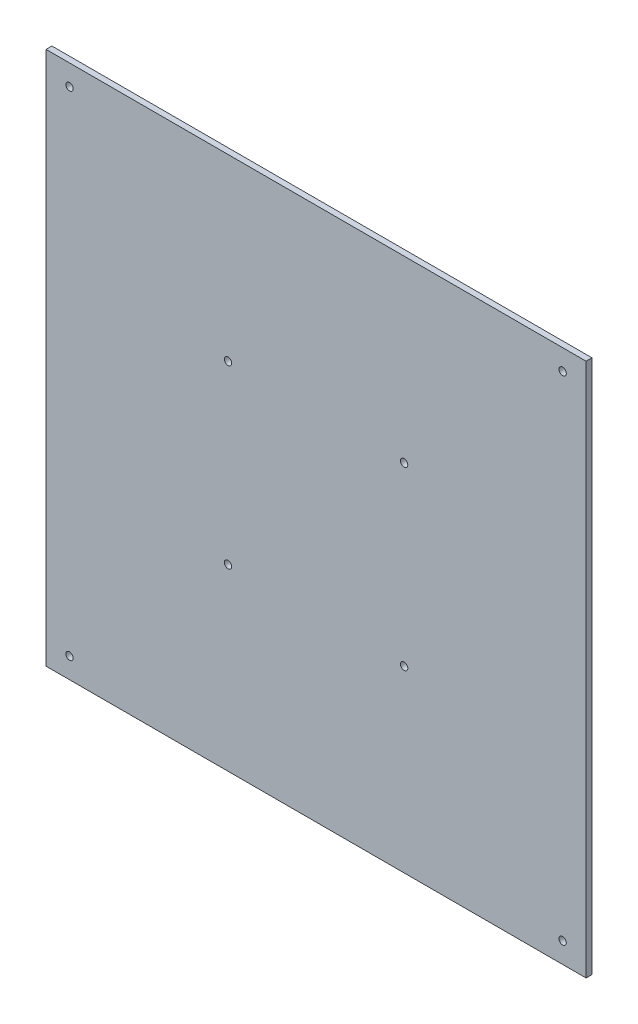
ISO-10303-21;
HEADER;
FILE_DESCRIPTION(('STEP AP214'),'2;1');
FILE_NAME('part.step','',(''),(''),'','','');
FILE_SCHEMA(('AUTOMOTIVE_DESIGN { 1 0 10303 214 1 1 1 1 }'));
ENDSEC;
DATA;
#1=APPLICATION_CONTEXT('core data for automotive mechanical design processes');
#2=APPLICATION_PROTOCOL_DEFINITION('international standard','automotive_design',2000,#1);
#3=PRODUCT_CONTEXT('',#1,'mechanical');
#4=PRODUCT('Part','Part','',(#3));
#5=PRODUCT_RELATED_PRODUCT_CATEGORY('part','',(#4));
#6=PRODUCT_DEFINITION_FORMATION('','',#4);
#7=PRODUCT_DEFINITION_CONTEXT('part definition',#1,'design');
#8=PRODUCT_DEFINITION('design','',#6,#7);
#9=PRODUCT_DEFINITION_SHAPE('','',#8);
#10=(LENGTH_UNIT() NAMED_UNIT(*) SI_UNIT(.MILLI.,.METRE.));
#11=(NAMED_UNIT(*) PLANE_ANGLE_UNIT() SI_UNIT($,.RADIAN.));
#12=(NAMED_UNIT(*) SI_UNIT($,.STERADIAN.) SOLID_ANGLE_UNIT());
#13=UNCERTAINTY_MEASURE_WITH_UNIT(LENGTH_MEASURE(1.E-05),#10,'distance_accuracy_value','');
#14=(GEOMETRIC_REPRESENTATION_CONTEXT(3) GLOBAL_UNCERTAINTY_ASSIGNED_CONTEXT((#13)) GLOBAL_UNIT_ASSIGNED_CONTEXT((#10,
#11,#12)) REPRESENTATION_CONTEXT('',''));
#15=CARTESIAN_POINT('',(0.,0.,0.));
#16=DIRECTION('',(0.,0.,1.));
#17=DIRECTION('',(1.,0.,0.));
#18=AXIS2_PLACEMENT_3D('',#15,#16,#17);
#19=CARTESIAN_POINT('',(0.,0.,2.));
#20=DIRECTION('',(0.,0.,-1.));
#21=DIRECTION('',(-1.,0.,0.));
#22=AXIS2_PLACEMENT_3D('',#19,#20,#21);
#23=PLANE('',#22);
#24=CARTESIAN_POINT('',(122.,121.,2.));
#25=DIRECTION('',(0.,0.,1.));
#26=DIRECTION('',(1.,0.,0.));
#27=AXIS2_PLACEMENT_3D('',#24,#25,#26);
#28=CIRCLE('',#27,1.24999999999999);
#29=CARTESIAN_POINT('',(123.25,121.,2.));
#30=VERTEX_POINT('',#29);
#31=EDGE_CURVE('E151',#30,#30,#28,.T.);
#32=ORIENTED_EDGE('',*,*,#31,.F.);
#33=EDGE_LOOP('',(#32));
#34=FACE_BOUND('',#33,.T.);
#35=CARTESIAN_POINT('',(62.,61.,2.));
#36=DIRECTION('',(0.,0.,1.));
#37=DIRECTION('',(1.,0.,0.));
#38=AXIS2_PLACEMENT_3D('',#35,#36,#37);
#39=CIRCLE('',#38,1.24999999999999);
#40=CARTESIAN_POINT('',(63.25,61.,2.));
#41=VERTEX_POINT('',#40);
#42=EDGE_CURVE('E145',#41,#41,#39,.T.);
#43=ORIENTED_EDGE('',*,*,#42,.F.);
#44=EDGE_LOOP('',(#43));
#45=FACE_BOUND('',#44,.T.);
#46=CARTESIAN_POINT('',(61.9999999999999,121.,2.));
#47=DIRECTION('',(0.,0.,1.));
#48=DIRECTION('',(1.,0.,0.));
#49=AXIS2_PLACEMENT_3D('',#46,#47,#48);
#50=CIRCLE('',#49,1.24999999999999);
#51=CARTESIAN_POINT('',(63.2499999999999,121.,2.));
#52=VERTEX_POINT('',#51);
#53=EDGE_CURVE('E139',#52,#52,#50,.T.);
#54=ORIENTED_EDGE('',*,*,#53,.F.);
#55=EDGE_LOOP('',(#54));
#56=FACE_BOUND('',#55,.T.);
#57=CARTESIAN_POINT('',(8.00000000000001,175.,2.));
#58=DIRECTION('',(0.,0.,1.));
#59=DIRECTION('',(1.,0.,0.));
#60=AXIS2_PLACEMENT_3D('',#57,#58,#59);
#61=CIRCLE('',#60,1.24999999999999);
#62=CARTESIAN_POINT('',(9.24999999999999,175.,2.));
#63=VERTEX_POINT('',#62);
#64=EDGE_CURVE('E133',#63,#63,#61,.T.);
#65=ORIENTED_EDGE('',*,*,#64,.F.);
#66=EDGE_LOOP('',(#65));
#67=FACE_BOUND('',#66,.T.);
#68=CARTESIAN_POINT('',(8.,7.,2.));
#69=DIRECTION('',(0.,0.,1.));
#70=DIRECTION('',(1.,0.,0.));
#71=AXIS2_PLACEMENT_3D('',#68,#69,#70);
#72=CIRCLE('',#71,1.24999999999999);
#73=CARTESIAN_POINT('',(9.24999999999999,7.,2.));
#74=VERTEX_POINT('',#73);
#75=EDGE_CURVE('E127',#74,#74,#72,.T.);
#76=ORIENTED_EDGE('',*,*,#75,.F.);
#77=EDGE_LOOP('',(#76));
#78=FACE_BOUND('',#77,.T.);
#79=CARTESIAN_POINT('',(176.,7.,2.));
#80=DIRECTION('',(0.,0.,1.));
#81=DIRECTION('',(1.,0.,0.));
#82=AXIS2_PLACEMENT_3D('',#79,#80,#81);
#83=CIRCLE('',#82,1.24999999999997);
#84=CARTESIAN_POINT('',(177.25,7.,2.));
#85=VERTEX_POINT('',#84);
#86=EDGE_CURVE('E121',#85,#85,#83,.T.);
#87=ORIENTED_EDGE('',*,*,#86,.F.);
#88=EDGE_LOOP('',(#87));
#89=FACE_BOUND('',#88,.T.);
#90=CARTESIAN_POINT('',(176.,175.,2.));
#91=DIRECTION('',(0.,0.,1.));
#92=DIRECTION('',(1.,0.,0.));
#93=AXIS2_PLACEMENT_3D('',#90,#91,#92);
#94=CIRCLE('',#93,1.24999999999997);
#95=CARTESIAN_POINT('',(177.25,175.,2.));
#96=VERTEX_POINT('',#95);
#97=EDGE_CURVE('E115',#96,#96,#94,.T.);
#98=ORIENTED_EDGE('',*,*,#97,.F.);
#99=EDGE_LOOP('',(#98));
#100=FACE_BOUND('',#99,.T.);
#101=DIRECTION('',(0.,-1.,0.));
#102=VECTOR('',#101,1.);
#103=CARTESIAN_POINT('',(0.,0.,2.));
#104=LINE('',#103,#102);
#105=CARTESIAN_POINT('',(0.,182.,2.));
#106=VERTEX_POINT('',#105);
#107=CARTESIAN_POINT('',(0.,0.,2.));
#108=VERTEX_POINT('',#107);
#109=EDGE_CURVE('E86',#106,#108,#104,.T.);
#110=ORIENTED_EDGE('',*,*,#109,.T.);
#111=DIRECTION('',(1.,0.,0.));
#112=VECTOR('',#111,1.);
#113=CARTESIAN_POINT('',(0.,0.,2.));
#114=LINE('',#113,#112);
#115=CARTESIAN_POINT('',(184.,0.,2.));
#116=VERTEX_POINT('',#115);
#117=EDGE_CURVE('E81',#108,#116,#114,.T.);
#118=ORIENTED_EDGE('',*,*,#117,.T.);
#119=DIRECTION('',(0.,1.,0.));
#120=VECTOR('',#119,1.);
#121=CARTESIAN_POINT('',(184.,0.,2.));
#122=LINE('',#121,#120);
#123=CARTESIAN_POINT('',(184.,182.,2.));
#124=VERTEX_POINT('',#123);
#125=EDGE_CURVE('E84',#116,#124,#122,.T.);
#126=ORIENTED_EDGE('',*,*,#125,.T.);
#127=DIRECTION('',(-1.,0.,0.));
#128=VECTOR('',#127,1.);
#129=CARTESIAN_POINT('',(0.,182.,2.));
#130=LINE('',#129,#128);
#131=EDGE_CURVE('E51',#124,#106,#130,.T.);
#132=ORIENTED_EDGE('',*,*,#131,.T.);
#133=EDGE_LOOP('',(#110,#118,#126,#132));
#134=FACE_BOUND('',#133,.T.);
#135=CARTESIAN_POINT('',(122.,61.,2.));
#136=DIRECTION('',(0.,0.,1.));
#137=DIRECTION('',(1.,0.,0.));
#138=AXIS2_PLACEMENT_3D('',#135,#136,#137);
#139=CIRCLE('',#138,1.24999999999999);
#140=CARTESIAN_POINT('',(123.25,61.,2.));
#141=VERTEX_POINT('',#140);
#142=EDGE_CURVE('E157',#141,#141,#139,.T.);
#143=ORIENTED_EDGE('',*,*,#142,.F.);
#144=EDGE_LOOP('',(#143));
#145=FACE_BOUND('',#144,.T.);
#146=ADVANCED_FACE('F34',(#34,#45,#56,#67,#78,#89,#100,#134,#145),#23,.F.);
#147=CARTESIAN_POINT('',(0.,0.,0.));
#148=DIRECTION('',(0.,0.,-1.));
#149=DIRECTION('',(-1.,0.,0.));
#150=AXIS2_PLACEMENT_3D('',#147,#148,#149);
#151=PLANE('',#150);
#152=CARTESIAN_POINT('',(122.,61.,0.));
#153=DIRECTION('',(0.,0.,1.));
#154=DIRECTION('',(1.,0.,0.));
#155=AXIS2_PLACEMENT_3D('',#152,#153,#154);
#156=CIRCLE('',#155,1.25);
#157=CARTESIAN_POINT('',(123.25,61.,0.));
#158=VERTEX_POINT('',#157);
#159=EDGE_CURVE('E154',#158,#158,#156,.T.);
#160=ORIENTED_EDGE('',*,*,#159,.T.);
#161=EDGE_LOOP('',(#160));
#162=FACE_BOUND('',#161,.T.);
#163=DIRECTION('',(0.,-1.,0.));
#164=VECTOR('',#163,1.);
#165=CARTESIAN_POINT('',(0.,0.,0.));
#166=LINE('',#165,#164);
#167=CARTESIAN_POINT('',(0.,182.,0.));
#168=VERTEX_POINT('',#167);
#169=CARTESIAN_POINT('',(0.,0.,0.));
#170=VERTEX_POINT('',#169);
#171=EDGE_CURVE('E98',#168,#170,#166,.T.);
#172=ORIENTED_EDGE('',*,*,#171,.F.);
#173=DIRECTION('',(-1.,0.,0.));
#174=VECTOR('',#173,1.);
#175=CARTESIAN_POINT('',(0.,182.,0.));
#176=LINE('',#175,#174);
#177=CARTESIAN_POINT('',(184.,182.,0.));
#178=VERTEX_POINT('',#177);
#179=EDGE_CURVE('E74',#178,#168,#176,.T.);
#180=ORIENTED_EDGE('',*,*,#179,.F.);
#181=DIRECTION('',(0.,1.,0.));
#182=VECTOR('',#181,1.);
#183=CARTESIAN_POINT('',(184.,0.,0.));
#184=LINE('',#183,#182);
#185=CARTESIAN_POINT('',(184.,0.,0.));
#186=VERTEX_POINT('',#185);
#187=EDGE_CURVE('E68',#186,#178,#184,.T.);
#188=ORIENTED_EDGE('',*,*,#187,.F.);
#189=DIRECTION('',(1.,0.,0.));
#190=VECTOR('',#189,1.);
#191=CARTESIAN_POINT('',(0.,0.,0.));
#192=LINE('',#191,#190);
#193=EDGE_CURVE('E90',#170,#186,#192,.T.);
#194=ORIENTED_EDGE('',*,*,#193,.F.);
#195=EDGE_LOOP('',(#172,#180,#188,#194));
#196=FACE_BOUND('',#195,.T.);
#197=CARTESIAN_POINT('',(176.,175.,0.));
#198=DIRECTION('',(0.,0.,1.));
#199=DIRECTION('',(1.,0.,0.));
#200=AXIS2_PLACEMENT_3D('',#197,#198,#199);
#201=CIRCLE('',#200,1.24999999999997);
#202=CARTESIAN_POINT('',(177.25,175.,0.));
#203=VERTEX_POINT('',#202);
#204=EDGE_CURVE('E101',#203,#203,#201,.T.);
#205=ORIENTED_EDGE('',*,*,#204,.T.);
#206=EDGE_LOOP('',(#205));
#207=FACE_BOUND('',#206,.T.);
#208=CARTESIAN_POINT('',(176.,7.,0.));
#209=DIRECTION('',(0.,0.,1.));
#210=DIRECTION('',(1.,0.,0.));
#211=AXIS2_PLACEMENT_3D('',#208,#209,#210);
#212=CIRCLE('',#211,1.24999999999997);
#213=CARTESIAN_POINT('',(177.25,7.,0.));
#214=VERTEX_POINT('',#213);
#215=EDGE_CURVE('E118',#214,#214,#212,.T.);
#216=ORIENTED_EDGE('',*,*,#215,.T.);
#217=EDGE_LOOP('',(#216));
#218=FACE_BOUND('',#217,.T.);
#219=CARTESIAN_POINT('',(8.,7.,0.));
#220=DIRECTION('',(0.,0.,1.));
#221=DIRECTION('',(1.,0.,0.));
#222=AXIS2_PLACEMENT_3D('',#219,#220,#221);
#223=CIRCLE('',#222,1.24999999999998);
#224=CARTESIAN_POINT('',(9.24999999999998,7.,0.));
#225=VERTEX_POINT('',#224);
#226=EDGE_CURVE('E124',#225,#225,#223,.T.);
#227=ORIENTED_EDGE('',*,*,#226,.T.);
#228=EDGE_LOOP('',(#227));
#229=FACE_BOUND('',#228,.T.);
#230=CARTESIAN_POINT('',(8.00000000000001,175.,0.));
#231=DIRECTION('',(0.,0.,1.));
#232=DIRECTION('',(1.,0.,0.));
#233=AXIS2_PLACEMENT_3D('',#230,#231,#232);
#234=CIRCLE('',#233,1.24999999999998);
#235=CARTESIAN_POINT('',(9.24999999999998,175.,0.));
#236=VERTEX_POINT('',#235);
#237=EDGE_CURVE('E130',#236,#236,#234,.T.);
#238=ORIENTED_EDGE('',*,*,#237,.T.);
#239=EDGE_LOOP('',(#238));
#240=FACE_BOUND('',#239,.T.);
#241=CARTESIAN_POINT('',(61.9999999999999,121.,0.));
#242=DIRECTION('',(0.,0.,1.));
#243=DIRECTION('',(1.,0.,0.));
#244=AXIS2_PLACEMENT_3D('',#241,#242,#243);
#245=CIRCLE('',#244,1.25);
#246=CARTESIAN_POINT('',(63.2499999999999,121.,0.));
#247=VERTEX_POINT('',#246);
#248=EDGE_CURVE('E136',#247,#247,#245,.T.);
#249=ORIENTED_EDGE('',*,*,#248,.T.);
#250=EDGE_LOOP('',(#249));
#251=FACE_BOUND('',#250,.T.);
#252=CARTESIAN_POINT('',(62.,61.,0.));
#253=DIRECTION('',(0.,0.,1.));
#254=DIRECTION('',(1.,0.,0.));
#255=AXIS2_PLACEMENT_3D('',#252,#253,#254);
#256=CIRCLE('',#255,1.25);
#257=CARTESIAN_POINT('',(63.25,61.,0.));
#258=VERTEX_POINT('',#257);
#259=EDGE_CURVE('E142',#258,#258,#256,.T.);
#260=ORIENTED_EDGE('',*,*,#259,.T.);
#261=EDGE_LOOP('',(#260));
#262=FACE_BOUND('',#261,.T.);
#263=CARTESIAN_POINT('',(122.,121.,0.));
#264=DIRECTION('',(0.,0.,1.));
#265=DIRECTION('',(1.,0.,0.));
#266=AXIS2_PLACEMENT_3D('',#263,#264,#265);
#267=CIRCLE('',#266,1.25);
#268=CARTESIAN_POINT('',(123.25,121.,0.));
#269=VERTEX_POINT('',#268);
#270=EDGE_CURVE('E148',#269,#269,#267,.T.);
#271=ORIENTED_EDGE('',*,*,#270,.T.);
#272=EDGE_LOOP('',(#271));
#273=FACE_BOUND('',#272,.T.);
#274=ADVANCED_FACE('F109',(#162,#196,#207,#218,#229,#240,#251,#262,#273),#151,.T.);
#275=CARTESIAN_POINT('',(0.,0.,2.));
#276=DIRECTION('',(1.,0.,0.));
#277=DIRECTION('',(0.,0.,-1.));
#278=AXIS2_PLACEMENT_3D('',#275,#276,#277);
#279=PLANE('',#278);
#280=ORIENTED_EDGE('',*,*,#171,.T.);
#281=DIRECTION('',(0.,0.,-1.));
#282=VECTOR('',#281,1.);
#283=CARTESIAN_POINT('',(0.,0.,2.));
#284=LINE('',#283,#282);
#285=EDGE_CURVE('E11',#108,#170,#284,.T.);
#286=ORIENTED_EDGE('',*,*,#285,.F.);
#287=ORIENTED_EDGE('',*,*,#109,.F.);
#288=DIRECTION('',(0.,0.,-1.));
#289=VECTOR('',#288,1.);
#290=CARTESIAN_POINT('',(0.,182.,2.));
#291=LINE('',#290,#289);
#292=EDGE_CURVE('E94',#106,#168,#291,.T.);
#293=ORIENTED_EDGE('',*,*,#292,.T.);
#294=EDGE_LOOP('',(#280,#286,#287,#293));
#295=FACE_BOUND('',#294,.T.);
#296=ADVANCED_FACE('F36',(#295),#279,.F.);
#297=CARTESIAN_POINT('',(0.,0.,2.));
#298=DIRECTION('',(0.,1.,0.));
#299=DIRECTION('',(0.,0.,1.));
#300=AXIS2_PLACEMENT_3D('',#297,#298,#299);
#301=PLANE('',#300);
#302=ORIENTED_EDGE('',*,*,#193,.T.);
#303=DIRECTION('',(0.,0.,-1.));
#304=VECTOR('',#303,1.);
#305=CARTESIAN_POINT('',(184.,0.,2.));
#306=LINE('',#305,#304);
#307=EDGE_CURVE('E43',#116,#186,#306,.T.);
#308=ORIENTED_EDGE('',*,*,#307,.F.);
#309=ORIENTED_EDGE('',*,*,#117,.F.);
#310=ORIENTED_EDGE('',*,*,#285,.T.);
#311=EDGE_LOOP('',(#302,#308,#309,#310));
#312=FACE_BOUND('',#311,.T.);
#313=ADVANCED_FACE('F89',(#312),#301,.F.);
#314=CARTESIAN_POINT('',(184.,0.,2.));
#315=DIRECTION('',(-1.,0.,0.));
#316=DIRECTION('',(0.,0.,1.));
#317=AXIS2_PLACEMENT_3D('',#314,#315,#316);
#318=PLANE('',#317);
#319=ORIENTED_EDGE('',*,*,#187,.T.);
#320=DIRECTION('',(0.,0.,-1.));
#321=VECTOR('',#320,1.);
#322=CARTESIAN_POINT('',(184.,182.,2.));
#323=LINE('',#322,#321);
#324=EDGE_CURVE('E91',#124,#178,#323,.T.);
#325=ORIENTED_EDGE('',*,*,#324,.F.);
#326=ORIENTED_EDGE('',*,*,#125,.F.);
#327=ORIENTED_EDGE('',*,*,#307,.T.);
#328=EDGE_LOOP('',(#319,#325,#326,#327));
#329=FACE_BOUND('',#328,.T.);
#330=ADVANCED_FACE('F92',(#329),#318,.F.);
#331=CARTESIAN_POINT('',(0.,182.,2.));
#332=DIRECTION('',(0.,-1.,0.));
#333=DIRECTION('',(0.,0.,-1.));
#334=AXIS2_PLACEMENT_3D('',#331,#332,#333);
#335=PLANE('',#334);
#336=ORIENTED_EDGE('',*,*,#179,.T.);
#337=ORIENTED_EDGE('',*,*,#292,.F.);
#338=ORIENTED_EDGE('',*,*,#131,.F.);
#339=ORIENTED_EDGE('',*,*,#324,.T.);
#340=EDGE_LOOP('',(#336,#337,#338,#339));
#341=FACE_BOUND('',#340,.T.);
#342=ADVANCED_FACE('F106',(#341),#335,.F.);
#343=CARTESIAN_POINT('',(176.,175.,2.));
#344=DIRECTION('',(0.,0.,1.));
#345=DIRECTION('',(1.,0.,0.));
#346=AXIS2_PLACEMENT_3D('',#343,#344,#345);
#347=CYLINDRICAL_SURFACE('',#346,1.24999999999997);
#348=ORIENTED_EDGE('',*,*,#204,.F.);
#349=EDGE_LOOP('',(#348));
#350=FACE_BOUND('',#349,.T.);
#351=ORIENTED_EDGE('',*,*,#97,.T.);
#352=EDGE_LOOP('',(#351));
#353=FACE_BOUND('',#352,.T.);
#354=ADVANCED_FACE('F173',(#350,#353),#347,.F.);
#355=CARTESIAN_POINT('',(176.,7.,2.));
#356=DIRECTION('',(0.,0.,1.));
#357=DIRECTION('',(1.,0.,0.));
#358=AXIS2_PLACEMENT_3D('',#355,#356,#357);
#359=CYLINDRICAL_SURFACE('',#358,1.24999999999997);
#360=ORIENTED_EDGE('',*,*,#215,.F.);
#361=EDGE_LOOP('',(#360));
#362=FACE_BOUND('',#361,.T.);
#363=ORIENTED_EDGE('',*,*,#86,.T.);
#364=EDGE_LOOP('',(#363));
#365=FACE_BOUND('',#364,.T.);
#366=ADVANCED_FACE('F245',(#362,#365),#359,.F.);
#367=CARTESIAN_POINT('',(8.,7.,2.));
#368=DIRECTION('',(0.,0.,1.));
#369=DIRECTION('',(1.,0.,0.));
#370=AXIS2_PLACEMENT_3D('',#367,#368,#369);
#371=CYLINDRICAL_SURFACE('',#370,1.24999999999998);
#372=ORIENTED_EDGE('',*,*,#226,.F.);
#373=EDGE_LOOP('',(#372));
#374=FACE_BOUND('',#373,.T.);
#375=ORIENTED_EDGE('',*,*,#75,.T.);
#376=EDGE_LOOP('',(#375));
#377=FACE_BOUND('',#376,.T.);
#378=ADVANCED_FACE('F255',(#374,#377),#371,.F.);
#379=CARTESIAN_POINT('',(8.00000000000001,175.,2.));
#380=DIRECTION('',(0.,0.,1.));
#381=DIRECTION('',(1.,0.,0.));
#382=AXIS2_PLACEMENT_3D('',#379,#380,#381);
#383=CYLINDRICAL_SURFACE('',#382,1.24999999999998);
#384=ORIENTED_EDGE('',*,*,#237,.F.);
#385=EDGE_LOOP('',(#384));
#386=FACE_BOUND('',#385,.T.);
#387=ORIENTED_EDGE('',*,*,#64,.T.);
#388=EDGE_LOOP('',(#387));
#389=FACE_BOUND('',#388,.T.);
#390=ADVANCED_FACE('F226',(#386,#389),#383,.F.);
#391=CARTESIAN_POINT('',(61.9999999999999,121.,2.));
#392=DIRECTION('',(0.,0.,1.));
#393=DIRECTION('',(1.,0.,0.));
#394=AXIS2_PLACEMENT_3D('',#391,#392,#393);
#395=CYLINDRICAL_SURFACE('',#394,1.24999999999999);
#396=ORIENTED_EDGE('',*,*,#248,.F.);
#397=EDGE_LOOP('',(#396));
#398=FACE_BOUND('',#397,.T.);
#399=ORIENTED_EDGE('',*,*,#53,.T.);
#400=EDGE_LOOP('',(#399));
#401=FACE_BOUND('',#400,.T.);
#402=ADVANCED_FACE('F221',(#398,#401),#395,.F.);
#403=CARTESIAN_POINT('',(62.,61.,2.));
#404=DIRECTION('',(0.,0.,1.));
#405=DIRECTION('',(1.,0.,0.));
#406=AXIS2_PLACEMENT_3D('',#403,#404,#405);
#407=CYLINDRICAL_SURFACE('',#406,1.24999999999999);
#408=ORIENTED_EDGE('',*,*,#259,.F.);
#409=EDGE_LOOP('',(#408));
#410=FACE_BOUND('',#409,.T.);
#411=ORIENTED_EDGE('',*,*,#42,.T.);
#412=EDGE_LOOP('',(#411));
#413=FACE_BOUND('',#412,.T.);
#414=ADVANCED_FACE('F204',(#410,#413),#407,.F.);
#415=CARTESIAN_POINT('',(122.,121.,2.));
#416=DIRECTION('',(0.,0.,1.));
#417=DIRECTION('',(1.,0.,0.));
#418=AXIS2_PLACEMENT_3D('',#415,#416,#417);
#419=CYLINDRICAL_SURFACE('',#418,1.24999999999999);
#420=ORIENTED_EDGE('',*,*,#270,.F.);
#421=EDGE_LOOP('',(#420));
#422=FACE_BOUND('',#421,.T.);
#423=ORIENTED_EDGE('',*,*,#31,.T.);
#424=EDGE_LOOP('',(#423));
#425=FACE_BOUND('',#424,.T.);
#426=ADVANCED_FACE('F198',(#422,#425),#419,.F.);
#427=CARTESIAN_POINT('',(122.,61.,2.));
#428=DIRECTION('',(0.,0.,1.));
#429=DIRECTION('',(1.,0.,0.));
#430=AXIS2_PLACEMENT_3D('',#427,#428,#429);
#431=CYLINDRICAL_SURFACE('',#430,1.24999999999999);
#432=ORIENTED_EDGE('',*,*,#159,.F.);
#433=EDGE_LOOP('',(#432));
#434=FACE_BOUND('',#433,.T.);
#435=ORIENTED_EDGE('',*,*,#142,.T.);
#436=EDGE_LOOP('',(#435));
#437=FACE_BOUND('',#436,.T.);
#438=ADVANCED_FACE('F161',(#434,#437),#431,.F.);
#439=CLOSED_SHELL('',(#146,#274,#296,#313,#330,#342,#354,#366,#378,#390,#402,#414,#426,#438));
#440=MANIFOLD_SOLID_BREP('B2',#439);
#441=ADVANCED_BREP_SHAPE_REPRESENTATION('',(#18,#440),#14);
#442=SHAPE_DEFINITION_REPRESENTATION(#9,#441);
ENDSEC;
END-ISO-10303-21;
